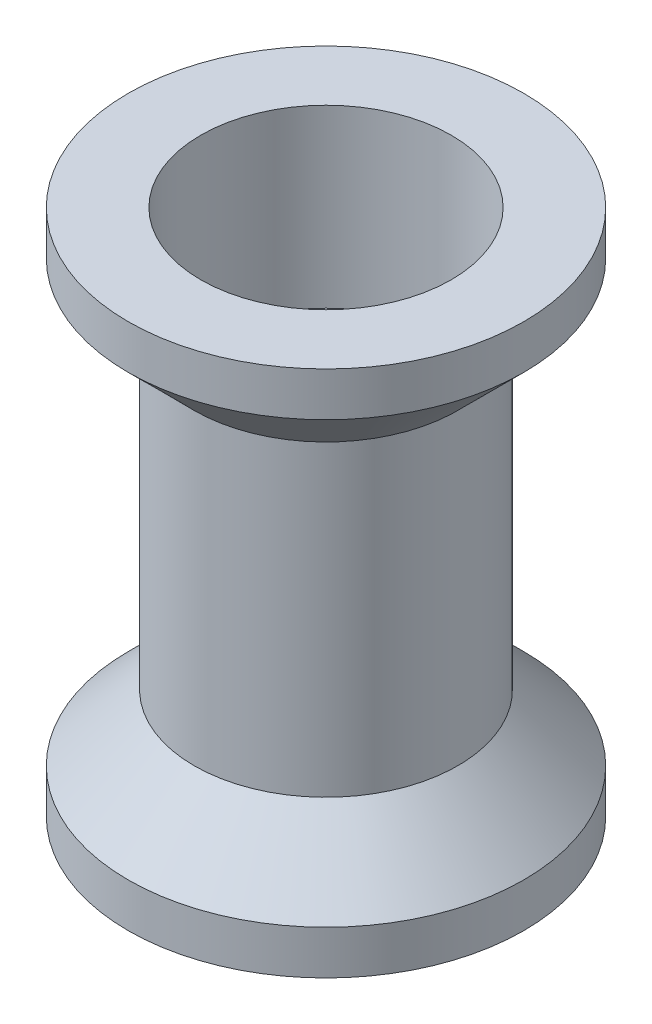
ISO-10303-21;
HEADER;
FILE_DESCRIPTION(('STEP AP214'),'2;1');
FILE_NAME('part.step','',(''),(''),'','','');
FILE_SCHEMA(('AUTOMOTIVE_DESIGN { 1 0 10303 214 1 1 1 1 }'));
ENDSEC;
DATA;
#1=APPLICATION_CONTEXT('core data for automotive mechanical design processes');
#2=APPLICATION_PROTOCOL_DEFINITION('international standard','automotive_design',2000,#1);
#3=PRODUCT_CONTEXT('',#1,'mechanical');
#4=PRODUCT('Part','Part','',(#3));
#5=PRODUCT_RELATED_PRODUCT_CATEGORY('part','',(#4));
#6=PRODUCT_DEFINITION_FORMATION('','',#4);
#7=PRODUCT_DEFINITION_CONTEXT('part definition',#1,'design');
#8=PRODUCT_DEFINITION('design','',#6,#7);
#9=PRODUCT_DEFINITION_SHAPE('','',#8);
#10=(LENGTH_UNIT() NAMED_UNIT(*) SI_UNIT(.MILLI.,.METRE.));
#11=(NAMED_UNIT(*) PLANE_ANGLE_UNIT() SI_UNIT($,.RADIAN.));
#12=(NAMED_UNIT(*) SI_UNIT($,.STERADIAN.) SOLID_ANGLE_UNIT());
#13=UNCERTAINTY_MEASURE_WITH_UNIT(LENGTH_MEASURE(1.E-05),#10,'distance_accuracy_value','');
#14=(GEOMETRIC_REPRESENTATION_CONTEXT(3) GLOBAL_UNCERTAINTY_ASSIGNED_CONTEXT((#13)) GLOBAL_UNIT_ASSIGNED_CONTEXT((#10,
#11,#12)) REPRESENTATION_CONTEXT('',''));
#15=CARTESIAN_POINT('',(0.,0.,0.));
#16=DIRECTION('',(0.,0.,1.));
#17=DIRECTION('',(1.,0.,0.));
#18=AXIS2_PLACEMENT_3D('',#15,#16,#17);
#19=CARTESIAN_POINT('',(0.,60.,0.));
#20=DIRECTION('',(0.,-1.,0.));
#21=DIRECTION('',(0.,0.,-1.));
#22=AXIS2_PLACEMENT_3D('',#19,#20,#21);
#23=CYLINDRICAL_SURFACE('',#22,22.5);
#24=CARTESIAN_POINT('',(0.,5.,0.));
#25=DIRECTION('',(0.,-1.,0.));
#26=DIRECTION('',(0.,0.,-1.));
#27=AXIS2_PLACEMENT_3D('',#24,#25,#26);
#28=CIRCLE('',#27,22.5);
#29=CARTESIAN_POINT('',(0.,5.,-22.5));
#30=VERTEX_POINT('',#29);
#31=EDGE_CURVE('E112',#30,#30,#28,.T.);
#32=ORIENTED_EDGE('',*,*,#31,.T.);
#33=EDGE_LOOP('',(#32));
#34=FACE_BOUND('',#33,.T.);
#35=CARTESIAN_POINT('',(0.,0.,0.));
#36=DIRECTION('',(0.,1.,0.));
#37=DIRECTION('',(0.,0.,1.));
#38=AXIS2_PLACEMENT_3D('',#35,#36,#37);
#39=CIRCLE('',#38,22.5);
#40=CARTESIAN_POINT('',(0.,0.,22.5));
#41=VERTEX_POINT('',#40);
#42=EDGE_CURVE('E78',#41,#41,#39,.T.);
#43=ORIENTED_EDGE('',*,*,#42,.T.);
#44=EDGE_LOOP('',(#43));
#45=FACE_BOUND('',#44,.T.);
#46=ADVANCED_FACE('F39',(#34,#45),#23,.T.);
#47=CARTESIAN_POINT('',(0.,60.,0.));
#48=DIRECTION('',(0.,-1.,0.));
#49=DIRECTION('',(0.,0.,-1.));
#50=AXIS2_PLACEMENT_3D('',#47,#48,#49);
#51=CYLINDRICAL_SURFACE('',#50,2.5);
#52=DIRECTION('',(0.,-1.,0.));
#53=VECTOR('',#52,1.);
#54=CARTESIAN_POINT('',(-1.76776695296637,60.,-1.76776695296637));
#55=LINE('',#54,#53);
#56=CARTESIAN_POINT('',(-1.76776695296637,40.,-1.76776695296637));
#57=VERTEX_POINT('',#56);
#58=CARTESIAN_POINT('',(-1.76776695296637,0.,-1.76776695296637));
#59=VERTEX_POINT('',#58);
#60=EDGE_CURVE('E59',#57,#59,#55,.T.);
#61=ORIENTED_EDGE('',*,*,#60,.F.);
#62=CARTESIAN_POINT('',(0.,40.,0.));
#63=DIRECTION('',(0.,1.,0.));
#64=DIRECTION('',(0.,0.,1.));
#65=AXIS2_PLACEMENT_3D('',#62,#63,#64);
#66=CIRCLE('',#65,2.5);
#67=CARTESIAN_POINT('',(1.76776695296637,40.,-1.76776695296637));
#68=VERTEX_POINT('',#67);
#69=EDGE_CURVE('E53',#57,#68,#66,.T.);
#70=ORIENTED_EDGE('',*,*,#69,.T.);
#71=DIRECTION('',(0.,-1.,0.));
#72=VECTOR('',#71,1.);
#73=CARTESIAN_POINT('',(1.76776695296637,60.,-1.76776695296637));
#74=LINE('',#73,#72);
#75=CARTESIAN_POINT('',(1.76776695296637,0.,-1.76776695296637));
#76=VERTEX_POINT('',#75);
#77=EDGE_CURVE('E70',#68,#76,#74,.T.);
#78=ORIENTED_EDGE('',*,*,#77,.T.);
#79=CARTESIAN_POINT('',(0.,0.,0.));
#80=DIRECTION('',(0.,1.,0.));
#81=DIRECTION('',(0.,0.,1.));
#82=AXIS2_PLACEMENT_3D('',#79,#80,#81);
#83=CIRCLE('',#82,2.5);
#84=EDGE_CURVE('E71',#59,#76,#83,.T.);
#85=ORIENTED_EDGE('',*,*,#84,.F.);
#86=EDGE_LOOP('',(#61,#70,#78,#85));
#87=FACE_BOUND('',#86,.T.);
#88=ADVANCED_FACE('F69',(#87),#51,.F.);
#89=CARTESIAN_POINT('',(1.76776695296637,60.,-1.76776695296637));
#90=DIRECTION('',(0.,0.,1.));
#91=DIRECTION('',(1.,0.,0.));
#92=AXIS2_PLACEMENT_3D('',#89,#90,#91);
#93=PLANE('',#92);
#94=ORIENTED_EDGE('',*,*,#77,.F.);
#95=DIRECTION('',(-1.,0.,0.));
#96=VECTOR('',#95,1.);
#97=CARTESIAN_POINT('',(1.76776695296637,40.,-1.76776695296637));
#98=LINE('',#97,#96);
#99=EDGE_CURVE('E11',#68,#57,#98,.T.);
#100=ORIENTED_EDGE('',*,*,#99,.T.);
#101=ORIENTED_EDGE('',*,*,#60,.T.);
#102=DIRECTION('',(-1.,0.,0.));
#103=VECTOR('',#102,1.);
#104=CARTESIAN_POINT('',(1.76776695296637,0.,-1.76776695296637));
#105=LINE('',#104,#103);
#106=EDGE_CURVE('E76',#76,#59,#105,.T.);
#107=ORIENTED_EDGE('',*,*,#106,.F.);
#108=EDGE_LOOP('',(#94,#100,#101,#107));
#109=FACE_BOUND('',#108,.T.);
#110=ADVANCED_FACE('F74',(#109),#93,.T.);
#111=CARTESIAN_POINT('',(0.,60.,0.));
#112=DIRECTION('',(0.,1.,0.));
#113=DIRECTION('',(0.,0.,1.));
#114=AXIS2_PLACEMENT_3D('',#111,#112,#113);
#115=PLANE('',#114);
#116=CARTESIAN_POINT('',(0.,60.,0.));
#117=DIRECTION('',(0.,1.,0.));
#118=DIRECTION('',(0.,0.,1.));
#119=AXIS2_PLACEMENT_3D('',#116,#117,#118);
#120=CIRCLE('',#119,14.25);
#121=CARTESIAN_POINT('',(0.,60.,14.25));
#122=VERTEX_POINT('',#121);
#123=EDGE_CURVE('E117',#122,#122,#120,.T.);
#124=ORIENTED_EDGE('',*,*,#123,.F.);
#125=EDGE_LOOP('',(#124));
#126=FACE_BOUND('',#125,.T.);
#127=CARTESIAN_POINT('',(0.,60.,0.));
#128=DIRECTION('',(0.,1.,0.));
#129=DIRECTION('',(0.,0.,1.));
#130=AXIS2_PLACEMENT_3D('',#127,#128,#129);
#131=CIRCLE('',#130,22.5);
#132=CARTESIAN_POINT('',(0.,60.,22.5));
#133=VERTEX_POINT('',#132);
#134=EDGE_CURVE('E47',#133,#133,#131,.T.);
#135=ORIENTED_EDGE('',*,*,#134,.T.);
#136=EDGE_LOOP('',(#135));
#137=FACE_BOUND('',#136,.T.);
#138=ADVANCED_FACE('F87',(#126,#137),#115,.T.);
#139=CARTESIAN_POINT('',(0.,0.,0.));
#140=DIRECTION('',(0.,1.,0.));
#141=DIRECTION('',(0.,0.,1.));
#142=AXIS2_PLACEMENT_3D('',#139,#140,#141);
#143=PLANE('',#142);
#144=ORIENTED_EDGE('',*,*,#42,.F.);
#145=EDGE_LOOP('',(#144));
#146=FACE_BOUND('',#145,.T.);
#147=ORIENTED_EDGE('',*,*,#84,.T.);
#148=ORIENTED_EDGE('',*,*,#106,.T.);
#149=EDGE_LOOP('',(#147,#148));
#150=FACE_BOUND('',#149,.T.);
#151=ADVANCED_FACE('F91',(#146,#150),#143,.F.);
#152=CARTESIAN_POINT('',(0.,55.,0.));
#153=DIRECTION('',(0.,-1.,0.));
#154=DIRECTION('',(0.,0.,-1.));
#155=AXIS2_PLACEMENT_3D('',#152,#153,#154);
#156=CIRCLE('',#155,22.5);
#157=CARTESIAN_POINT('',(0.,55.,-22.5));
#158=VERTEX_POINT('',#157);
#159=EDGE_CURVE('E123',#158,#158,#156,.T.);
#160=ORIENTED_EDGE('',*,*,#159,.F.);
#161=EDGE_LOOP('',(#160));
#162=FACE_BOUND('',#161,.T.);
#163=ORIENTED_EDGE('',*,*,#134,.F.);
#164=EDGE_LOOP('',(#163));
#165=FACE_BOUND('',#164,.T.);
#166=ADVANCED_FACE('F41',(#162,#165),#23,.T.);
#167=CARTESIAN_POINT('',(0.,40.,0.));
#168=DIRECTION('',(0.,1.,0.));
#169=DIRECTION('',(0.,0.,1.));
#170=AXIS2_PLACEMENT_3D('',#167,#168,#169);
#171=CYLINDRICAL_SURFACE('',#170,14.25);
#172=CARTESIAN_POINT('',(0.,40.,0.));
#173=DIRECTION('',(0.,1.,0.));
#174=DIRECTION('',(0.,0.,1.));
#175=AXIS2_PLACEMENT_3D('',#172,#173,#174);
#176=CIRCLE('',#175,14.25);
#177=CARTESIAN_POINT('',(0.,40.,14.25));
#178=VERTEX_POINT('',#177);
#179=EDGE_CURVE('E72',#178,#178,#176,.T.);
#180=ORIENTED_EDGE('',*,*,#179,.F.);
#181=EDGE_LOOP('',(#180));
#182=FACE_BOUND('',#181,.T.);
#183=ORIENTED_EDGE('',*,*,#123,.T.);
#184=EDGE_LOOP('',(#183));
#185=FACE_BOUND('',#184,.T.);
#186=ADVANCED_FACE('F90',(#182,#185),#171,.F.);
#187=CARTESIAN_POINT('',(0.,40.,0.));
#188=DIRECTION('',(0.,1.,0.));
#189=DIRECTION('',(0.,0.,1.));
#190=AXIS2_PLACEMENT_3D('',#187,#188,#189);
#191=PLANE('',#190);
#192=ORIENTED_EDGE('',*,*,#99,.F.);
#193=ORIENTED_EDGE('',*,*,#69,.F.);
#194=EDGE_LOOP('',(#192,#193));
#195=FACE_BOUND('',#194,.T.);
#196=ORIENTED_EDGE('',*,*,#179,.T.);
#197=EDGE_LOOP('',(#196));
#198=FACE_BOUND('',#197,.T.);
#199=ADVANCED_FACE('F65',(#195,#198),#191,.T.);
#200=CARTESIAN_POINT('',(0.,12.5,0.));
#201=DIRECTION('',(0.,-1.,0.));
#202=DIRECTION('',(0.,0.,-1.));
#203=AXIS2_PLACEMENT_3D('',#200,#201,#202);
#204=CONICAL_SURFACE('',#203,15.,0.785398163397449);
#205=ORIENTED_EDGE('',*,*,#31,.F.);
#206=EDGE_LOOP('',(#205));
#207=FACE_BOUND('',#206,.T.);
#208=CARTESIAN_POINT('',(0.,12.5,0.));
#209=DIRECTION('',(0.,-1.,0.));
#210=DIRECTION('',(0.,0.,-1.));
#211=AXIS2_PLACEMENT_3D('',#208,#209,#210);
#212=CIRCLE('',#211,15.);
#213=CARTESIAN_POINT('',(0.,12.5,-15.));
#214=VERTEX_POINT('',#213);
#215=EDGE_CURVE('E129',#214,#214,#212,.T.);
#216=ORIENTED_EDGE('',*,*,#215,.T.);
#217=EDGE_LOOP('',(#216));
#218=FACE_BOUND('',#217,.T.);
#219=ADVANCED_FACE('F133',(#207,#218),#204,.T.);
#220=CARTESIAN_POINT('',(0.,55.,0.));
#221=DIRECTION('',(0.,1.,0.));
#222=DIRECTION('',(0.,0.,1.));
#223=AXIS2_PLACEMENT_3D('',#220,#221,#222);
#224=CONICAL_SURFACE('',#223,22.5,0.785398163397449);
#225=CARTESIAN_POINT('',(0.,47.5,0.));
#226=DIRECTION('',(0.,-1.,0.));
#227=DIRECTION('',(0.,0.,-1.));
#228=AXIS2_PLACEMENT_3D('',#225,#226,#227);
#229=CIRCLE('',#228,15.);
#230=CARTESIAN_POINT('',(0.,47.5,-15.));
#231=VERTEX_POINT('',#230);
#232=EDGE_CURVE('E126',#231,#231,#229,.T.);
#233=ORIENTED_EDGE('',*,*,#232,.F.);
#234=EDGE_LOOP('',(#233));
#235=FACE_BOUND('',#234,.T.);
#236=ORIENTED_EDGE('',*,*,#159,.T.);
#237=EDGE_LOOP('',(#236));
#238=FACE_BOUND('',#237,.T.);
#239=ADVANCED_FACE('F138',(#235,#238),#224,.T.);
#240=CARTESIAN_POINT('',(0.,-24.3875901336423,0.));
#241=DIRECTION('',(0.,-1.,0.));
#242=DIRECTION('',(0.,0.,-1.));
#243=AXIS2_PLACEMENT_3D('',#240,#241,#242);
#244=CYLINDRICAL_SURFACE('',#243,15.);
#245=ORIENTED_EDGE('',*,*,#215,.F.);
#246=EDGE_LOOP('',(#245));
#247=FACE_BOUND('',#246,.T.);
#248=ORIENTED_EDGE('',*,*,#232,.T.);
#249=EDGE_LOOP('',(#248));
#250=FACE_BOUND('',#249,.T.);
#251=ADVANCED_FACE('F135',(#247,#250),#244,.T.);
#252=CLOSED_SHELL('',(#46,#88,#110,#138,#151,#166,#186,#199,#219,#239,#251));
#253=MANIFOLD_SOLID_BREP('B2',#252);
#254=ADVANCED_BREP_SHAPE_REPRESENTATION('',(#18,#253),#14);
#255=SHAPE_DEFINITION_REPRESENTATION(#9,#254);
ENDSEC;
END-ISO-10303-21;
